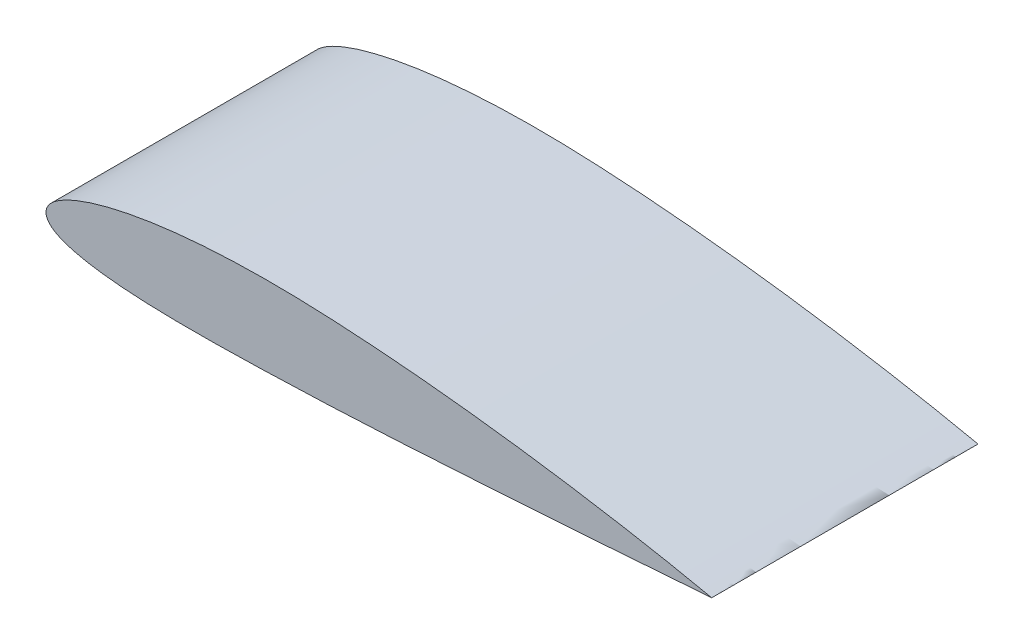
ISO-10303-21;
HEADER;
FILE_DESCRIPTION(('STEP AP214'),'2;1');
FILE_NAME('part.step','',(''),(''),'','','');
FILE_SCHEMA(('AUTOMOTIVE_DESIGN { 1 0 10303 214 1 1 1 1 }'));
ENDSEC;
DATA;
#1=APPLICATION_CONTEXT('core data for automotive mechanical design processes');
#2=APPLICATION_PROTOCOL_DEFINITION('international standard','automotive_design',2000,#1);
#3=PRODUCT_CONTEXT('',#1,'mechanical');
#4=PRODUCT('Part','Part','',(#3));
#5=PRODUCT_RELATED_PRODUCT_CATEGORY('part','',(#4));
#6=PRODUCT_DEFINITION_FORMATION('','',#4);
#7=PRODUCT_DEFINITION_CONTEXT('part definition',#1,'design');
#8=PRODUCT_DEFINITION('design','',#6,#7);
#9=PRODUCT_DEFINITION_SHAPE('','',#8);
#10=(LENGTH_UNIT() NAMED_UNIT(*) SI_UNIT(.MILLI.,.METRE.));
#11=(NAMED_UNIT(*) PLANE_ANGLE_UNIT() SI_UNIT($,.RADIAN.));
#12=(NAMED_UNIT(*) SI_UNIT($,.STERADIAN.) SOLID_ANGLE_UNIT());
#13=UNCERTAINTY_MEASURE_WITH_UNIT(LENGTH_MEASURE(1.E-05),#10,'distance_accuracy_value','');
#14=(GEOMETRIC_REPRESENTATION_CONTEXT(3) GLOBAL_UNCERTAINTY_ASSIGNED_CONTEXT((#13)) GLOBAL_UNIT_ASSIGNED_CONTEXT((#10,
#11,#12)) REPRESENTATION_CONTEXT('',''));
#15=CARTESIAN_POINT('',(0.,0.,0.));
#16=DIRECTION('',(0.,0.,1.));
#17=DIRECTION('',(1.,0.,0.));
#18=AXIS2_PLACEMENT_3D('',#15,#16,#17);
#19=CARTESIAN_POINT('',(750.,0.,300.));
#20=CARTESIAN_POINT('',(750.00059637436,0.00894434278039879,300.));
#21=CARTESIAN_POINT('',(749.60615658763,0.0711642119072489,300.));
#22=CARTESIAN_POINT('',(749.201769100923,0.178831621197275,300.));
#23=CARTESIAN_POINT('',(748.204040280567,0.379499827893671,300.));
#24=CARTESIAN_POINT('',(746.960563285463,0.649456270299362,300.));
#25=CARTESIAN_POINT('',(745.302702775964,0.999188412372496,300.));
#26=CARTESIAN_POINT('',(743.302006781728,1.42297216398564,300.));
#27=CARTESIAN_POINT('',(740.934106092303,1.92126984010554,300.));
#28=CARTESIAN_POINT('',(738.210413827483,2.4919705666027,300.));
#29=CARTESIAN_POINT('',(735.130338448377,3.1335764270224,300.));
#30=CARTESIAN_POINT('',(731.697748517541,3.84411503419558,300.));
#31=CARTESIAN_POINT('',(727.915504142312,4.62151932926806,300.));
#32=CARTESIAN_POINT('',(723.787220295921,5.46351214177191,300.));
#33=CARTESIAN_POINT('',(719.316708881753,6.36766549871789,300.));
#34=CARTESIAN_POINT('',(714.508147234259,7.33138851613699,300.));
#35=CARTESIAN_POINT('',(709.366025754072,8.35195649454599,300.));
#36=CARTESIAN_POINT('',(703.895159287034,9.42651323421049,300.));
#37=CARTESIAN_POINT('',(698.100680067457,10.5520851691694,300.));
#38=CARTESIAN_POINT('',(691.988036264319,11.7255980420855,300.));
#39=CARTESIAN_POINT('',(685.562987123017,12.9438842098815,300.));
#40=CARTESIAN_POINT('',(678.831600321564,14.2037000876167,300.));
#41=CARTESIAN_POINT('',(671.800246013912,15.50173123032,300.));
#42=CARTESIAN_POINT('',(664.475593694882,16.8346071590186,300.));
#43=CARTESIAN_POINT('',(656.864605861052,18.1989106035328,300.));
#44=CARTESIAN_POINT('',(648.974533560866,19.5911880609839,300.));
#45=CARTESIAN_POINT('',(640.812909382869,21.0079568672114,300.));
#46=CARTESIAN_POINT('',(632.387542800734,22.4457161871929,300.));
#47=CARTESIAN_POINT('',(623.706511867916,23.9009460271046,300.));
#48=CARTESIAN_POINT('',(614.778158513352,25.3701298762508,300.));
#49=CARTESIAN_POINT('',(605.611078588321,26.8497398325797,300.));
#50=CARTESIAN_POINT('',(596.214116219534,28.3362577685815,300.));
#51=CARTESIAN_POINT('',(586.596354865747,29.8261689247228,300.));
#52=CARTESIAN_POINT('',(576.767109792574,31.3159700996454,300.));
#53=CARTESIAN_POINT('',(566.735919718877,32.8021746656084,300.));
#54=CARTESIAN_POINT('',(556.512536872329,34.2813083699233,300.));
#55=CARTESIAN_POINT('',(546.106919094296,35.7499137091524,300.));
#56=CARTESIAN_POINT('',(535.529221012521,37.2045554047315,300.));
#57=CARTESIAN_POINT('',(524.789783258662,38.6418144160979,300.));
#58=CARTESIAN_POINT('',(513.899123696047,40.0582972449824,300.));
#59=CARTESIAN_POINT('',(502.867927239274,41.4506291819895,300.));
#60=CARTESIAN_POINT('',(491.707036444062,42.8154622701537,300.));
#61=CARTESIAN_POINT('',(480.427440563864,44.1494732994452,300.));
#62=CARTESIAN_POINT('',(469.040265480587,45.4493680497943,300.));
#63=CARTESIAN_POINT('',(457.556763764668,46.7118868613046,300.));
#64=CARTESIAN_POINT('',(445.988302839773,47.9337953639792,300.));
#65=CARTESIAN_POINT('',(434.346354991297,49.1119090562361,300.));
#66=CARTESIAN_POINT('',(422.642486098668,50.2430784717279,300.));
#67=CARTESIAN_POINT('',(410.888343887591,51.3242082441407,300.));
#68=CARTESIAN_POINT('',(399.09564827484,52.3522547914486,300.));
#69=CARTESIAN_POINT('',(387.276177438675,53.3242410567104,300.));
#70=CARTESIAN_POINT('',(375.441758266716,54.2372590824149,300.));
#71=CARTESIAN_POINT('',(363.604252654059,55.0884817082142,300.));
#72=CARTESIAN_POINT('',(351.775547127406,55.8751778848549,300.));
#73=CARTESIAN_POINT('',(339.967537937441,56.5946966390341,300.));
#74=CARTESIAN_POINT('',(328.192124234786,57.2445704730552,300.));
#75=CARTESIAN_POINT('',(316.461176066108,57.8221918121543,300.));
#76=CARTESIAN_POINT('',(304.768306728481,58.3268743213183,300.));
#77=CARTESIAN_POINT('',(293.112384318195,58.753638259663,300.));
#78=CARTESIAN_POINT('',(281.504387817428,59.0736602222852,300.));
#79=CARTESIAN_POINT('',(269.97492420862,59.2908265387338,300.));
#80=CARTESIAN_POINT('',(258.548725110707,59.4022458306176,300.));
#81=CARTESIAN_POINT('',(247.237859174899,59.4077214452801,300.));
#82=CARTESIAN_POINT('',(236.054271664185,59.3068210254286,300.));
#83=CARTESIAN_POINT('',(225.009797092654,59.0995570840153,300.));
#84=CARTESIAN_POINT('',(214.116133054755,58.7862203245225,300.));
#85=CARTESIAN_POINT('',(203.384824725658,58.3674287651453,300.));
#86=CARTESIAN_POINT('',(192.827247787594,57.8441138407992,300.));
#87=CARTESIAN_POINT('',(182.454589408909,57.2175280201313,300.));
#88=CARTESIAN_POINT('',(172.277833198406,56.4892441623344,300.));
#89=CARTESIAN_POINT('',(162.307739893302,55.6611428826921,300.));
#90=CARTESIAN_POINT('',(152.5548325072,54.7354225879151,300.));
#91=CARTESIAN_POINT('',(143.029379327512,53.7145716251483,300.));
#92=CARTESIAN_POINT('',(133.741378647357,52.6013761649744,300.));
#93=CARTESIAN_POINT('',(124.700543627353,51.3988951837205,300.));
#94=CARTESIAN_POINT('',(115.916288260485,50.1104556446286,300.));
#95=CARTESIAN_POINT('',(107.397714464839,48.7396219343625,300.));
#96=CARTESIAN_POINT('',(99.1535981088292,47.2901930790073,300.));
#97=CARTESIAN_POINT('',(91.192378725592,45.7661667014255,300.));
#98=CARTESIAN_POINT('',(83.5221475566035,44.1717266144834,300.));
#99=CARTESIAN_POINT('',(76.1506386793389,42.5112100465012,300.));
#100=CARTESIAN_POINT('',(69.0852184481354,40.789085372185,300.));
#101=CARTESIAN_POINT('',(62.3328781633523,39.0099218166641,300.));
#102=CARTESIAN_POINT('',(55.9002253368938,37.1783618866404,300.));
#103=CARTESIAN_POINT('',(49.7934790673985,35.2990842146928,300.));
#104=CARTESIAN_POINT('',(44.0184593584114,33.3767816273955,300.));
#105=CARTESIAN_POINT('',(38.5805848566515,31.4161171889753,300.));
#106=CARTESIAN_POINT('',(33.4848631135298,29.4216969587957,300.));
#107=CARTESIAN_POINT('',(28.735884498407,27.3980306495006,300.));
#108=CARTESIAN_POINT('',(24.3378104065495,25.3494989228903,300.));
#109=CARTESIAN_POINT('',(20.2943715104097,23.2802942230421,300.));
#110=CARTESIAN_POINT('',(16.60884868999,21.1943918560049,300.));
#111=CARTESIAN_POINT('',(13.2840709306175,19.0954721134246,300.));
#112=CARTESIAN_POINT('',(10.322413333847,16.9868432897934,300.));
#113=CARTESIAN_POINT('',(7.72581598515885,14.8713368856836,300.));
#114=CARTESIAN_POINT('',(5.49586661345299,12.7511594774266,300.));
#115=CARTESIAN_POINT('',(3.63399077626009,10.6277422260436,300.));
#116=CARTESIAN_POINT('',(2.14185089816681,8.50166071839382,300.));
#117=CARTESIAN_POINT('',(1.02196358650339,6.37287428461146,300.));
#118=CARTESIAN_POINT('',(0.278257301254894,4.24169294238076,300.));
#119=CARTESIAN_POINT('',(-0.0842820468450436,2.110324604644,300.));
#120=CARTESIAN_POINT('',(-0.0621879250578903,-0.00622322177395133,300.));
#121=CARTESIAN_POINT('',(0.335244441390352,-2.08508826508935,300.));
#122=CARTESIAN_POINT('',(1.11092356927229,-4.10240605481586,300.));
#123=CARTESIAN_POINT('',(2.25700131271319,-6.04489536656704,300.));
#124=CARTESIAN_POINT('',(3.76689792225681,-7.91232142303453,300.));
#125=CARTESIAN_POINT('',(5.63553840809136,-9.70626743748864,300.));
#126=CARTESIAN_POINT('',(7.85935473741906,-11.4285802963476,300.));
#127=CARTESIAN_POINT('',(10.4355523399722,-13.0805616083435,300.));
#128=CARTESIAN_POINT('',(13.361465929571,-14.6628841763932,300.));
#129=CARTESIAN_POINT('',(16.634217932586,-16.1757227990254,300.));
#130=CARTESIAN_POINT('',(20.2505624229221,-17.618947053466,300.));
#131=CARTESIAN_POINT('',(24.2068518392499,-18.9922499611621,300.));
#132=CARTESIAN_POINT('',(28.4990388201325,-20.295257981775,300.));
#133=CARTESIAN_POINT('',(33.1227044675192,-21.5275740052172,300.));
#134=CARTESIAN_POINT('',(38.0730763190668,-22.6888510802599,300.));
#135=CARTESIAN_POINT('',(43.3450588253787,-23.7787925695911,300.));
#136=CARTESIAN_POINT('',(48.9332501971088,-24.7972045180724,300.));
#137=CARTESIAN_POINT('',(54.8319638301147,-25.7439908680373,300.));
#138=CARTESIAN_POINT('',(61.0352432066026,-26.6191843629083,300.));
#139=CARTESIAN_POINT('',(67.5368739682601,-27.4229595331774,300.));
#140=CARTESIAN_POINT('',(74.3304007245167,-28.1556331189734,300.));
#141=CARTESIAN_POINT('',(81.4091346323397,-28.8176910960779,300.));
#142=CARTESIAN_POINT('',(88.766165502776,-29.4097890739869,300.));
#143=CARTESIAN_POINT('',(96.3943702706653,-29.9327570845801,300.));
#144=CARTESIAN_POINT('',(104.286420802727,-30.3876152036017,300.));
#145=CARTESIAN_POINT('',(112.434793530384,-30.7755688968869,300.));
#146=CARTESIAN_POINT('',(120.831774298599,-31.0980184951465,300.));
#147=CARTESIAN_POINT('',(129.4694659191,-31.3565532309368,300.));
#148=CARTESIAN_POINT('',(138.339791884653,-31.5529598859742,300.));
#149=CARTESIAN_POINT('',(147.434503477732,-31.6892036154795,300.));
#150=CARTESIAN_POINT('',(156.745182872919,-31.7674421621881,300.));
#151=CARTESIAN_POINT('',(166.263248374246,-31.7900047620677,300.));
#152=CARTESIAN_POINT('',(175.979958031053,-31.7593833864774,300.));
#153=CARTESIAN_POINT('',(185.88641218177,-31.6782349576502,300.));
#154=CARTESIAN_POINT('',(195.973558135713,-31.5493502747081,300.));
#155=CARTESIAN_POINT('',(206.232191309082,-31.3756554883181,300.));
#156=CARTESIAN_POINT('',(216.652961287394,-31.1601897358165,300.));
#157=CARTESIAN_POINT('',(227.22637168009,-30.9060836809872,300.));
#158=CARTESIAN_POINT('',(237.942786845426,-30.616554940642,300.));
#159=CARTESIAN_POINT('',(248.792431229334,-30.2948680420496,300.));
#160=CARTESIAN_POINT('',(259.765398207883,-29.9443634145448,300.));
#161=CARTESIAN_POINT('',(270.851644578268,-29.568262881412,300.));
#162=CARTESIAN_POINT('',(282.041023411475,-29.1703280661753,300.));
#163=CARTESIAN_POINT('',(293.335847272423,-28.7517803698554,300.));
#164=CARTESIAN_POINT('',(304.744079475362,-28.3212871537351,300.));
#165=CARTESIAN_POINT('',(316.253882213853,-27.8553145110932,300.));
#166=CARTESIAN_POINT('',(327.84133776041,-27.3540098898144,300.));
#167=CARTESIAN_POINT('',(339.477036028816,-26.8216193645963,300.));
#168=CARTESIAN_POINT('',(351.149748845449,-26.2606394425348,300.));
#169=CARTESIAN_POINT('',(362.848204809782,-25.6737923030507,300.));
#170=CARTESIAN_POINT('',(374.561084599981,-25.0636864707445,300.));
#171=CARTESIAN_POINT('',(386.27703466142,-24.4328830779712,300.));
#172=CARTESIAN_POINT('',(397.984677963689,-23.7838695206583,300.));
#173=CARTESIAN_POINT('',(409.6726246001,-23.119050854833,300.));
#174=CARTESIAN_POINT('',(421.32948267388,-22.4407451180017,300.));
#175=CARTESIAN_POINT('',(432.943869076346,-21.7511733955792,300.));
#176=CARTESIAN_POINT('',(444.504420608589,-21.0524569493498,300.));
#177=CARTESIAN_POINT('',(455.999806450058,-20.3466152351302,300.));
#178=CARTESIAN_POINT('',(467.418738031147,-19.6355570237376,300.));
#179=CARTESIAN_POINT('',(478.749982711487,-18.9210899967334,300.));
#180=CARTESIAN_POINT('',(489.982372579822,-18.2049132901543,300.));
#181=CARTESIAN_POINT('',(501.104817596844,-17.4886215029185,300.));
#182=CARTESIAN_POINT('',(512.106315815742,-16.7737116531863,300.));
#183=CARTESIAN_POINT('',(522.975966513668,-16.0615839200863,300.));
#184=CARTESIAN_POINT('',(533.702979951577,-15.3535473417991,300.));
#185=CARTESIAN_POINT('',(544.276689408692,-14.6508222762654,300.));
#186=CARTESIAN_POINT('',(554.686561699279,-13.9545587823822,300.));
#187=CARTESIAN_POINT('',(564.922208119706,-13.2658280271782,300.));
#188=CARTESIAN_POINT('',(574.973395277044,-12.5856371480608,300.));
#189=CARTESIAN_POINT('',(584.830057348914,-11.9149448480258,300.));
#190=CARTESIAN_POINT('',(594.482304398462,-11.2546497917867,300.));
#191=CARTESIAN_POINT('',(603.920434360283,-10.6056160357272,300.));
#192=CARTESIAN_POINT('',(613.134942692762,-9.96867127819963,300.));
#193=CARTESIAN_POINT('',(622.116532428783,-9.34461366084966,300.));
#194=CARTESIAN_POINT('',(630.856124840554,-8.7342221768373,300.));
#195=CARTESIAN_POINT('',(639.344868529452,-8.13825506433839,300.));
#196=CARTESIAN_POINT('',(647.574150201306,-7.5574648820344,300.));
#197=CARTESIAN_POINT('',(655.535603007805,-6.99259340468956,300.));
#198=CARTESIAN_POINT('',(663.221116035034,-6.44437690007199,300.));
#199=CARTESIAN_POINT('',(670.622845006048,-5.91355360613789,300.));
#200=CARTESIAN_POINT('',(677.733219491543,-5.40085896057276,300.));
#201=CARTESIAN_POINT('',(684.544953263229,-4.9070266411324,300.));
#202=CARTESIAN_POINT('',(691.051051658428,-4.43279708316975,300.));
#203=CARTESIAN_POINT('',(697.244821279478,-3.9788997276204,300.));
#204=CARTESIAN_POINT('',(703.11987707755,-3.54606900060208,300.));
#205=CARTESIAN_POINT('',(708.67015176343,-3.13503090879763,300.));
#206=CARTESIAN_POINT('',(713.889901711541,-2.74649743024143,300.));
#207=CARTESIAN_POINT('',(718.77371572058,-2.38117374563713,300.));
#208=CARTESIAN_POINT('',(723.316524999556,-2.03974423436645,300.));
#209=CARTESIAN_POINT('',(727.513594944654,-1.72287095578056,300.));
#210=CARTESIAN_POINT('',(731.360583881869,-1.43118770743668,300.));
#211=CARTESIAN_POINT('',(734.853376595702,-1.16529510289584,300.));
#212=CARTESIAN_POINT('',(737.988646567276,-0.925772917266211,300.));
#213=CARTESIAN_POINT('',(740.762098965446,-0.713079116157727,300.));
#214=CARTESIAN_POINT('',(743.173936021538,-0.52788778962953,300.));
#215=CARTESIAN_POINT('',(745.212408392852,-0.370011539588302,300.));
#216=CARTESIAN_POINT('',(746.901581634662,-0.241554590658317,300.));
#217=CARTESIAN_POINT('',(748.169678739611,-0.138157222713589,300.));
#218=CARTESIAN_POINT('',(749.185121578828,-0.0713711351296544,300.));
#219=CARTESIAN_POINT('',(749.600202192631,-0.0182609895391847,300.));
#220=CARTESIAN_POINT('',(749.99940362818,-0.00894430468257293,300.));
#221=CARTESIAN_POINT('',(750.,0.,300.));
#222=B_SPLINE_CURVE_WITH_KNOTS('',3,(#19,#20,#21,#22,#23,#24,#25,#26,#27,#28,#29,#30,#31,#32,
#33,#34,#35,#36,#37,#38,#39,#40,#41,#42,#43,#44,#45,#46,#47,#48,#49,#50,#51,#52,#53,#54,#55,#56,
#57,#58,#59,#60,#61,#62,#63,#64,#65,#66,#67,#68,#69,#70,#71,#72,#73,#74,#75,#76,#77,#78,#79,#80,
#81,#82,#83,#84,#85,#86,#87,#88,#89,#90,#91,#92,#93,#94,#95,#96,#97,#98,#99,#100,#101,#102,#103,
#104,#105,#106,#107,#108,#109,#110,#111,#112,#113,#114,#115,#116,#117,#118,#119,#120,#121,#122,
#123,#124,#125,#126,#127,#128,#129,#130,#131,#132,#133,#134,#135,#136,#137,#138,#139,#140,#141,
#142,#143,#144,#145,#146,#147,#148,#149,#150,#151,#152,#153,#154,#155,#156,#157,#158,#159,#160,
#161,#162,#163,#164,#165,#166,#167,#168,#169,#170,#171,#172,#173,#174,#175,#176,#177,#178,#179,
#180,#181,#182,#183,#184,#185,#186,#187,#188,#189,#190,#191,#192,#193,#194,#195,#196,#197,#198,
#199,#200,#201,#202,#203,#204,#205,#206,#207,#208,#209,#210,#211,#212,#213,#214,#215,#216,#217,
#218,#219,#220,#221),.UNSPECIFIED.,.T.,.F.,(4,1,1,1,1,1,1,1,1,1,1,1,1,1,1,1,1,1,1,1,1,1,1,1,1,1,
1,1,1,1,1,1,1,1,1,1,1,1,1,1,1,1,1,1,1,1,1,1,1,1,1,1,1,1,1,1,1,1,1,1,1,1,1,1,1,1,1,1,1,1,1,1,1,1,
1,1,1,1,1,1,1,1,1,1,1,1,1,1,1,1,1,1,1,1,1,1,1,1,1,1,1,1,1,1,1,1,1,1,1,1,1,1,1,1,1,1,1,1,1,1,1,1,
1,1,1,1,1,1,1,1,1,1,1,1,1,1,1,1,1,1,1,1,1,1,1,1,1,1,1,1,1,1,1,1,1,1,1,1,1,1,1,1,1,1,1,1,1,1,1,1,
1,1,1,1,1,1,1,1,1,1,1,1,1,1,1,1,1,1,1,1,1,1,1,1,1,1,1,1,1,1,4),(0.,0.000122379526219418,
0.000489393934242715,0.0011006708442205,0.00195559087417023,0.00305328806125948,
0.00439265097944524,0.00597232306531816,0.00779070859232981,0.00984596852789568,
0.0121360288733665,0.0146585787955268,0.0174110774589511,0.0203907538425948,0.023594611521331,
0.0270194340848003,0.0306617853910921,0.0345180155557075,0.0385842658600357,0.0428564710579365,
0.0473303646869126,0.0520014843549915,0.0568651754125301,0.0619165943227794,0.0671507178757192,
0.0725623435336317,0.0781460963900936,0.0838964350048582,0.0898076547455636,0.0958738953847061,
0.102089144821709,0.108447245706325,0.114941900546506,0.121566677351257,0.128315016742029,
0.135180237547704,0.142155541117404,0.149234020475161,0.156408666729702,0.16367237370535,
0.171017945722381,0.178438106461147,0.185925504142202,0.193472719332877,0.201072273817932,
0.208716636529681,0.216398235012732,0.224109458574965,0.231842672226539,0.239590219808424,
0.247344438696116,0.255097662929863,0.262842236056038,0.270570519317459,0.278274899909376,
0.285947801838502,0.293581693128175,0.301204962501008,0.308799342158639,0.316332599380389,
0.323797398431745,0.331186489883989,0.338492716376622,0.345709023991109,0.35282846888675,
0.359844228373424,0.366749609363242,0.373538053434806,0.380203152445548,0.386738648770577,
0.393138451090368,0.399396638171703,0.405507470229925,0.411465396362775,0.41726506574649,
0.422901334622364,0.42836928088811,0.433664212930504,0.438781683538432,0.443717505739822,
0.448467769228042,0.453028862200621,0.457397494616231,0.461570729312972,0.465546018382526,
0.469321251396038,0.472894812000899,0.476265656869378,0.479433415667584,0.482398521790502,
0.485162390566742,0.487727657352882,0.490098505330126,0.49228111045637,0.494284243734673,
0.496120072573903,0.497805161219031,0.499361588009031,0.500817880111078,0.502209190542024,
0.50357598024236,0.504942762863381,0.506333878068483,0.507789314587988,0.509343562964949,
0.511024414753632,0.512853216003413,0.514845834431592,0.517013791898336,0.519365263772125,
0.521905878330572,0.524639316715791,0.527567756370775,0.530692198952171,0.534012705632508,
0.537528579002625,0.541238491827433,0.545140592985183,0.549232579305468,0.553511760133102,
0.557975100210742,0.562619262778327,0.567440635423553,0.572435354739772,0.577599329158005,
0.582928253014114,0.588417623052892,0.594062747088006,0.59985875661756,0.605800613007089,
0.611883118328297,0.61810091955194,0.624448515702408,0.630920265338279,0.637510387320099,
0.644212971856322,0.651021980388785,0.657931255893389,0.664934521928596,0.672025394823855,
0.679197381391584,0.686443891525275,0.693758239076311,0.701133649141969,0.708588086832467,
0.716125335513148,0.723702286696347,0.731311634445121,0.738946019491122,0.746598038371046,
0.754260250882362,0.761925187750964,0.769585360531168,0.777233270863281,0.784861416199554,
0.792462299420943,0.800028438211827,0.807552370392148,0.815026665764844,0.822443931004298,
0.82979681996633,0.837078037823698,0.844280352876973,0.851396600575067,0.85841969396759,
0.865342628168785,0.872158489132555,0.878860458966725,0.885441824658568,0.891895983518514,
0.898216451093588,0.904396865754413,0.910430996363446,0.916312749194657,0.922036172148087,
0.927595463092015,0.932984975318937,0.938199222754594,0.943232886283173,0.948080820019768,
0.952738058555498,0.957199818152499,0.961461508357249,0.965518732314991,0.969367296286498,
0.973003211269068,0.97642270234438,0.979622209223991,0.982598395145935,0.98534814967421,
0.987868592203214,0.990157078574435,0.992211202331564,0.994028801147666,0.995607958691053,
0.996947006446502,0.998044530294918,0.998899367676009,0.999510613967512,0.999877620995048,1.),.UNSPECIFIED.);
#223=DIRECTION('',(0.,0.,-1.));
#224=VECTOR('',#223,1.);
#225=SURFACE_OF_LINEAR_EXTRUSION('',#222,#224);
#226=CARTESIAN_POINT('',(750.,0.,300.));
#227=VERTEX_POINT('',#226);
#228=EDGE_CURVE('E10',#227,#227,#222,.T.);
#229=ORIENTED_EDGE('',*,*,#228,.F.);
#230=EDGE_LOOP('',(#229));
#231=FACE_BOUND('',#230,.T.);
#232=CARTESIAN_POINT('',(750.,0.,0.));
#233=CARTESIAN_POINT('',(750.00059637436,0.00894434278039879,0.));
#234=CARTESIAN_POINT('',(749.60615658763,0.0711642119072489,0.));
#235=CARTESIAN_POINT('',(749.201769100923,0.178831621197275,0.));
#236=CARTESIAN_POINT('',(748.204040280567,0.379499827893671,0.));
#237=CARTESIAN_POINT('',(746.960563285463,0.649456270299362,0.));
#238=CARTESIAN_POINT('',(745.302702775964,0.999188412372496,0.));
#239=CARTESIAN_POINT('',(743.302006781728,1.42297216398564,0.));
#240=CARTESIAN_POINT('',(740.934106092303,1.92126984010554,0.));
#241=CARTESIAN_POINT('',(738.210413827483,2.4919705666027,0.));
#242=CARTESIAN_POINT('',(735.130338448377,3.1335764270224,0.));
#243=CARTESIAN_POINT('',(731.697748517541,3.84411503419558,0.));
#244=CARTESIAN_POINT('',(727.915504142312,4.62151932926806,0.));
#245=CARTESIAN_POINT('',(723.787220295921,5.46351214177191,0.));
#246=CARTESIAN_POINT('',(719.316708881753,6.36766549871789,0.));
#247=CARTESIAN_POINT('',(714.508147234259,7.33138851613699,0.));
#248=CARTESIAN_POINT('',(709.366025754072,8.35195649454599,0.));
#249=CARTESIAN_POINT('',(703.895159287034,9.42651323421049,0.));
#250=CARTESIAN_POINT('',(698.100680067457,10.5520851691694,0.));
#251=CARTESIAN_POINT('',(691.988036264319,11.7255980420855,0.));
#252=CARTESIAN_POINT('',(685.562987123017,12.9438842098815,0.));
#253=CARTESIAN_POINT('',(678.831600321564,14.2037000876167,0.));
#254=CARTESIAN_POINT('',(671.800246013912,15.50173123032,0.));
#255=CARTESIAN_POINT('',(664.475593694882,16.8346071590186,0.));
#256=CARTESIAN_POINT('',(656.864605861052,18.1989106035328,0.));
#257=CARTESIAN_POINT('',(648.974533560866,19.5911880609839,0.));
#258=CARTESIAN_POINT('',(640.812909382869,21.0079568672114,0.));
#259=CARTESIAN_POINT('',(632.387542800734,22.4457161871929,0.));
#260=CARTESIAN_POINT('',(623.706511867916,23.9009460271046,0.));
#261=CARTESIAN_POINT('',(614.778158513352,25.3701298762508,0.));
#262=CARTESIAN_POINT('',(605.611078588321,26.8497398325797,0.));
#263=CARTESIAN_POINT('',(596.214116219534,28.3362577685815,0.));
#264=CARTESIAN_POINT('',(586.596354865747,29.8261689247228,0.));
#265=CARTESIAN_POINT('',(576.767109792574,31.3159700996454,0.));
#266=CARTESIAN_POINT('',(566.735919718877,32.8021746656084,0.));
#267=CARTESIAN_POINT('',(556.512536872329,34.2813083699233,0.));
#268=CARTESIAN_POINT('',(546.106919094296,35.7499137091524,0.));
#269=CARTESIAN_POINT('',(535.529221012521,37.2045554047315,0.));
#270=CARTESIAN_POINT('',(524.789783258662,38.6418144160979,0.));
#271=CARTESIAN_POINT('',(513.899123696047,40.0582972449824,0.));
#272=CARTESIAN_POINT('',(502.867927239274,41.4506291819895,0.));
#273=CARTESIAN_POINT('',(491.707036444062,42.8154622701537,0.));
#274=CARTESIAN_POINT('',(480.427440563864,44.1494732994452,0.));
#275=CARTESIAN_POINT('',(469.040265480587,45.4493680497943,0.));
#276=CARTESIAN_POINT('',(457.556763764668,46.7118868613046,0.));
#277=CARTESIAN_POINT('',(445.988302839773,47.9337953639792,0.));
#278=CARTESIAN_POINT('',(434.346354991297,49.1119090562361,0.));
#279=CARTESIAN_POINT('',(422.642486098668,50.2430784717279,0.));
#280=CARTESIAN_POINT('',(410.888343887591,51.3242082441407,0.));
#281=CARTESIAN_POINT('',(399.09564827484,52.3522547914486,0.));
#282=CARTESIAN_POINT('',(387.276177438675,53.3242410567104,0.));
#283=CARTESIAN_POINT('',(375.441758266716,54.2372590824149,0.));
#284=CARTESIAN_POINT('',(363.604252654059,55.0884817082142,0.));
#285=CARTESIAN_POINT('',(351.775547127406,55.8751778848549,0.));
#286=CARTESIAN_POINT('',(339.967537937441,56.5946966390341,0.));
#287=CARTESIAN_POINT('',(328.192124234786,57.2445704730552,0.));
#288=CARTESIAN_POINT('',(316.461176066108,57.8221918121543,0.));
#289=CARTESIAN_POINT('',(304.768306728481,58.3268743213183,0.));
#290=CARTESIAN_POINT('',(293.112384318195,58.753638259663,0.));
#291=CARTESIAN_POINT('',(281.504387817428,59.0736602222852,0.));
#292=CARTESIAN_POINT('',(269.97492420862,59.2908265387338,0.));
#293=CARTESIAN_POINT('',(258.548725110707,59.4022458306176,0.));
#294=CARTESIAN_POINT('',(247.237859174899,59.4077214452801,0.));
#295=CARTESIAN_POINT('',(236.054271664185,59.3068210254286,0.));
#296=CARTESIAN_POINT('',(225.009797092654,59.0995570840153,0.));
#297=CARTESIAN_POINT('',(214.116133054755,58.7862203245225,0.));
#298=CARTESIAN_POINT('',(203.384824725658,58.3674287651453,0.));
#299=CARTESIAN_POINT('',(192.827247787594,57.8441138407992,0.));
#300=CARTESIAN_POINT('',(182.454589408909,57.2175280201313,0.));
#301=CARTESIAN_POINT('',(172.277833198406,56.4892441623344,0.));
#302=CARTESIAN_POINT('',(162.307739893302,55.6611428826921,0.));
#303=CARTESIAN_POINT('',(152.5548325072,54.7354225879151,0.));
#304=CARTESIAN_POINT('',(143.029379327512,53.7145716251483,0.));
#305=CARTESIAN_POINT('',(133.741378647357,52.6013761649744,0.));
#306=CARTESIAN_POINT('',(124.700543627353,51.3988951837205,0.));
#307=CARTESIAN_POINT('',(115.916288260485,50.1104556446286,0.));
#308=CARTESIAN_POINT('',(107.397714464839,48.7396219343625,0.));
#309=CARTESIAN_POINT('',(99.1535981088292,47.2901930790073,0.));
#310=CARTESIAN_POINT('',(91.192378725592,45.7661667014255,0.));
#311=CARTESIAN_POINT('',(83.5221475566035,44.1717266144834,0.));
#312=CARTESIAN_POINT('',(76.1506386793389,42.5112100465012,0.));
#313=CARTESIAN_POINT('',(69.0852184481354,40.789085372185,0.));
#314=CARTESIAN_POINT('',(62.3328781633523,39.0099218166641,0.));
#315=CARTESIAN_POINT('',(55.9002253368938,37.1783618866404,0.));
#316=CARTESIAN_POINT('',(49.7934790673985,35.2990842146928,0.));
#317=CARTESIAN_POINT('',(44.0184593584114,33.3767816273955,0.));
#318=CARTESIAN_POINT('',(38.5805848566515,31.4161171889753,0.));
#319=CARTESIAN_POINT('',(33.4848631135298,29.4216969587957,0.));
#320=CARTESIAN_POINT('',(28.735884498407,27.3980306495006,0.));
#321=CARTESIAN_POINT('',(24.3378104065495,25.3494989228903,0.));
#322=CARTESIAN_POINT('',(20.2943715104097,23.2802942230421,0.));
#323=CARTESIAN_POINT('',(16.60884868999,21.1943918560049,0.));
#324=CARTESIAN_POINT('',(13.2840709306175,19.0954721134246,0.));
#325=CARTESIAN_POINT('',(10.322413333847,16.9868432897934,0.));
#326=CARTESIAN_POINT('',(7.72581598515885,14.8713368856836,0.));
#327=CARTESIAN_POINT('',(5.49586661345299,12.7511594774266,0.));
#328=CARTESIAN_POINT('',(3.63399077626009,10.6277422260436,0.));
#329=CARTESIAN_POINT('',(2.14185089816681,8.50166071839382,0.));
#330=CARTESIAN_POINT('',(1.02196358650339,6.37287428461146,0.));
#331=CARTESIAN_POINT('',(0.278257301254894,4.24169294238076,0.));
#332=CARTESIAN_POINT('',(-0.0842820468450436,2.110324604644,0.));
#333=CARTESIAN_POINT('',(-0.0621879250578903,-0.00622322177395133,0.));
#334=CARTESIAN_POINT('',(0.335244441390352,-2.08508826508935,0.));
#335=CARTESIAN_POINT('',(1.11092356927229,-4.10240605481586,0.));
#336=CARTESIAN_POINT('',(2.25700131271319,-6.04489536656704,0.));
#337=CARTESIAN_POINT('',(3.76689792225681,-7.91232142303453,0.));
#338=CARTESIAN_POINT('',(5.63553840809136,-9.70626743748864,0.));
#339=CARTESIAN_POINT('',(7.85935473741906,-11.4285802963476,0.));
#340=CARTESIAN_POINT('',(10.4355523399722,-13.0805616083435,0.));
#341=CARTESIAN_POINT('',(13.361465929571,-14.6628841763932,0.));
#342=CARTESIAN_POINT('',(16.634217932586,-16.1757227990254,0.));
#343=CARTESIAN_POINT('',(20.2505624229221,-17.618947053466,0.));
#344=CARTESIAN_POINT('',(24.2068518392499,-18.9922499611621,0.));
#345=CARTESIAN_POINT('',(28.4990388201325,-20.295257981775,0.));
#346=CARTESIAN_POINT('',(33.1227044675192,-21.5275740052172,0.));
#347=CARTESIAN_POINT('',(38.0730763190668,-22.6888510802599,0.));
#348=CARTESIAN_POINT('',(43.3450588253787,-23.7787925695911,0.));
#349=CARTESIAN_POINT('',(48.9332501971088,-24.7972045180724,0.));
#350=CARTESIAN_POINT('',(54.8319638301147,-25.7439908680373,0.));
#351=CARTESIAN_POINT('',(61.0352432066026,-26.6191843629083,0.));
#352=CARTESIAN_POINT('',(67.5368739682601,-27.4229595331774,0.));
#353=CARTESIAN_POINT('',(74.3304007245167,-28.1556331189734,0.));
#354=CARTESIAN_POINT('',(81.4091346323397,-28.8176910960779,0.));
#355=CARTESIAN_POINT('',(88.766165502776,-29.4097890739869,0.));
#356=CARTESIAN_POINT('',(96.3943702706653,-29.9327570845801,0.));
#357=CARTESIAN_POINT('',(104.286420802727,-30.3876152036017,0.));
#358=CARTESIAN_POINT('',(112.434793530384,-30.7755688968869,0.));
#359=CARTESIAN_POINT('',(120.831774298599,-31.0980184951465,0.));
#360=CARTESIAN_POINT('',(129.4694659191,-31.3565532309368,0.));
#361=CARTESIAN_POINT('',(138.339791884653,-31.5529598859742,0.));
#362=CARTESIAN_POINT('',(147.434503477732,-31.6892036154795,0.));
#363=CARTESIAN_POINT('',(156.745182872919,-31.7674421621881,0.));
#364=CARTESIAN_POINT('',(166.263248374246,-31.7900047620677,0.));
#365=CARTESIAN_POINT('',(175.979958031053,-31.7593833864774,0.));
#366=CARTESIAN_POINT('',(185.88641218177,-31.6782349576502,0.));
#367=CARTESIAN_POINT('',(195.973558135713,-31.5493502747081,0.));
#368=CARTESIAN_POINT('',(206.232191309082,-31.3756554883181,0.));
#369=CARTESIAN_POINT('',(216.652961287394,-31.1601897358165,0.));
#370=CARTESIAN_POINT('',(227.22637168009,-30.9060836809872,0.));
#371=CARTESIAN_POINT('',(237.942786845426,-30.616554940642,0.));
#372=CARTESIAN_POINT('',(248.792431229334,-30.2948680420496,0.));
#373=CARTESIAN_POINT('',(259.765398207883,-29.9443634145448,0.));
#374=CARTESIAN_POINT('',(270.851644578268,-29.568262881412,0.));
#375=CARTESIAN_POINT('',(282.041023411475,-29.1703280661753,0.));
#376=CARTESIAN_POINT('',(293.335847272423,-28.7517803698554,0.));
#377=CARTESIAN_POINT('',(304.744079475362,-28.3212871537351,0.));
#378=CARTESIAN_POINT('',(316.253882213853,-27.8553145110932,0.));
#379=CARTESIAN_POINT('',(327.84133776041,-27.3540098898144,0.));
#380=CARTESIAN_POINT('',(339.477036028816,-26.8216193645963,0.));
#381=CARTESIAN_POINT('',(351.149748845449,-26.2606394425348,0.));
#382=CARTESIAN_POINT('',(362.848204809782,-25.6737923030507,0.));
#383=CARTESIAN_POINT('',(374.561084599981,-25.0636864707445,0.));
#384=CARTESIAN_POINT('',(386.27703466142,-24.4328830779712,0.));
#385=CARTESIAN_POINT('',(397.984677963689,-23.7838695206583,0.));
#386=CARTESIAN_POINT('',(409.6726246001,-23.119050854833,0.));
#387=CARTESIAN_POINT('',(421.32948267388,-22.4407451180017,0.));
#388=CARTESIAN_POINT('',(432.943869076346,-21.7511733955792,0.));
#389=CARTESIAN_POINT('',(444.504420608589,-21.0524569493498,0.));
#390=CARTESIAN_POINT('',(455.999806450058,-20.3466152351302,0.));
#391=CARTESIAN_POINT('',(467.418738031147,-19.6355570237376,0.));
#392=CARTESIAN_POINT('',(478.749982711487,-18.9210899967334,0.));
#393=CARTESIAN_POINT('',(489.982372579822,-18.2049132901543,0.));
#394=CARTESIAN_POINT('',(501.104817596844,-17.4886215029185,0.));
#395=CARTESIAN_POINT('',(512.106315815742,-16.7737116531863,0.));
#396=CARTESIAN_POINT('',(522.975966513668,-16.0615839200863,0.));
#397=CARTESIAN_POINT('',(533.702979951577,-15.3535473417991,0.));
#398=CARTESIAN_POINT('',(544.276689408692,-14.6508222762654,0.));
#399=CARTESIAN_POINT('',(554.686561699279,-13.9545587823822,0.));
#400=CARTESIAN_POINT('',(564.922208119706,-13.2658280271782,0.));
#401=CARTESIAN_POINT('',(574.973395277044,-12.5856371480608,0.));
#402=CARTESIAN_POINT('',(584.830057348914,-11.9149448480258,0.));
#403=CARTESIAN_POINT('',(594.482304398462,-11.2546497917867,0.));
#404=CARTESIAN_POINT('',(603.920434360283,-10.6056160357272,0.));
#405=CARTESIAN_POINT('',(613.134942692762,-9.96867127819963,0.));
#406=CARTESIAN_POINT('',(622.116532428783,-9.34461366084966,0.));
#407=CARTESIAN_POINT('',(630.856124840554,-8.7342221768373,0.));
#408=CARTESIAN_POINT('',(639.344868529452,-8.13825506433839,0.));
#409=CARTESIAN_POINT('',(647.574150201306,-7.5574648820344,0.));
#410=CARTESIAN_POINT('',(655.535603007805,-6.99259340468956,0.));
#411=CARTESIAN_POINT('',(663.221116035034,-6.44437690007199,0.));
#412=CARTESIAN_POINT('',(670.622845006048,-5.91355360613789,0.));
#413=CARTESIAN_POINT('',(677.733219491543,-5.40085896057276,0.));
#414=CARTESIAN_POINT('',(684.544953263229,-4.9070266411324,0.));
#415=CARTESIAN_POINT('',(691.051051658428,-4.43279708316975,0.));
#416=CARTESIAN_POINT('',(697.244821279478,-3.9788997276204,0.));
#417=CARTESIAN_POINT('',(703.11987707755,-3.54606900060208,0.));
#418=CARTESIAN_POINT('',(708.67015176343,-3.13503090879763,0.));
#419=CARTESIAN_POINT('',(713.889901711541,-2.74649743024143,0.));
#420=CARTESIAN_POINT('',(718.77371572058,-2.38117374563713,0.));
#421=CARTESIAN_POINT('',(723.316524999556,-2.03974423436645,0.));
#422=CARTESIAN_POINT('',(727.513594944654,-1.72287095578056,0.));
#423=CARTESIAN_POINT('',(731.360583881869,-1.43118770743668,0.));
#424=CARTESIAN_POINT('',(734.853376595702,-1.16529510289584,0.));
#425=CARTESIAN_POINT('',(737.988646567276,-0.925772917266211,0.));
#426=CARTESIAN_POINT('',(740.762098965446,-0.713079116157727,0.));
#427=CARTESIAN_POINT('',(743.173936021538,-0.52788778962953,0.));
#428=CARTESIAN_POINT('',(745.212408392852,-0.370011539588302,0.));
#429=CARTESIAN_POINT('',(746.901581634662,-0.241554590658317,0.));
#430=CARTESIAN_POINT('',(748.169678739611,-0.138157222713589,0.));
#431=CARTESIAN_POINT('',(749.185121578828,-0.0713711351296544,0.));
#432=CARTESIAN_POINT('',(749.600202192631,-0.0182609895391847,0.));
#433=CARTESIAN_POINT('',(749.99940362818,-0.00894430468257293,0.));
#434=CARTESIAN_POINT('',(750.,0.,0.));
#435=B_SPLINE_CURVE_WITH_KNOTS('',3,(#232,#233,#234,#235,#236,#237,#238,#239,#240,#241,#242,
#243,#244,#245,#246,#247,#248,#249,#250,#251,#252,#253,#254,#255,#256,#257,#258,#259,#260,#261,
#262,#263,#264,#265,#266,#267,#268,#269,#270,#271,#272,#273,#274,#275,#276,#277,#278,#279,#280,
#281,#282,#283,#284,#285,#286,#287,#288,#289,#290,#291,#292,#293,#294,#295,#296,#297,#298,#299,
#300,#301,#302,#303,#304,#305,#306,#307,#308,#309,#310,#311,#312,#313,#314,#315,#316,#317,#318,
#319,#320,#321,#322,#323,#324,#325,#326,#327,#328,#329,#330,#331,#332,#333,#334,#335,#336,#337,
#338,#339,#340,#341,#342,#343,#344,#345,#346,#347,#348,#349,#350,#351,#352,#353,#354,#355,#356,
#357,#358,#359,#360,#361,#362,#363,#364,#365,#366,#367,#368,#369,#370,#371,#372,#373,#374,#375,
#376,#377,#378,#379,#380,#381,#382,#383,#384,#385,#386,#387,#388,#389,#390,#391,#392,#393,#394,
#395,#396,#397,#398,#399,#400,#401,#402,#403,#404,#405,#406,#407,#408,#409,#410,#411,#412,#413,
#414,#415,#416,#417,#418,#419,#420,#421,#422,#423,#424,#425,#426,#427,#428,#429,#430,#431,#432,
#433,#434),.UNSPECIFIED.,.T.,.F.,(4,1,1,1,1,1,1,1,1,1,1,1,1,1,1,1,1,1,1,1,1,1,1,1,1,1,1,1,1,1,1,
1,1,1,1,1,1,1,1,1,1,1,1,1,1,1,1,1,1,1,1,1,1,1,1,1,1,1,1,1,1,1,1,1,1,1,1,1,1,1,1,1,1,1,1,1,1,1,1,
1,1,1,1,1,1,1,1,1,1,1,1,1,1,1,1,1,1,1,1,1,1,1,1,1,1,1,1,1,1,1,1,1,1,1,1,1,1,1,1,1,1,1,1,1,1,1,1,
1,1,1,1,1,1,1,1,1,1,1,1,1,1,1,1,1,1,1,1,1,1,1,1,1,1,1,1,1,1,1,1,1,1,1,1,1,1,1,1,1,1,1,1,1,1,1,1,
1,1,1,1,1,1,1,1,1,1,1,1,1,1,1,1,1,1,1,1,1,1,1,1,1,4),(0.,0.000122379526219418,
0.000489393934242715,0.0011006708442205,0.00195559087417023,0.00305328806125948,
0.00439265097944524,0.00597232306531816,0.00779070859232981,0.00984596852789568,
0.0121360288733665,0.0146585787955268,0.0174110774589511,0.0203907538425948,0.023594611521331,
0.0270194340848003,0.0306617853910921,0.0345180155557075,0.0385842658600357,0.0428564710579365,
0.0473303646869126,0.0520014843549915,0.0568651754125301,0.0619165943227794,0.0671507178757192,
0.0725623435336317,0.0781460963900936,0.0838964350048582,0.0898076547455636,0.0958738953847061,
0.102089144821709,0.108447245706325,0.114941900546506,0.121566677351257,0.128315016742029,
0.135180237547704,0.142155541117404,0.149234020475161,0.156408666729702,0.16367237370535,
0.171017945722381,0.178438106461147,0.185925504142202,0.193472719332877,0.201072273817932,
0.208716636529681,0.216398235012732,0.224109458574965,0.231842672226539,0.239590219808424,
0.247344438696116,0.255097662929863,0.262842236056038,0.270570519317459,0.278274899909376,
0.285947801838502,0.293581693128175,0.301204962501008,0.308799342158639,0.316332599380389,
0.323797398431745,0.331186489883989,0.338492716376622,0.345709023991109,0.35282846888675,
0.359844228373424,0.366749609363242,0.373538053434806,0.380203152445548,0.386738648770577,
0.393138451090368,0.399396638171703,0.405507470229925,0.411465396362775,0.41726506574649,
0.422901334622364,0.42836928088811,0.433664212930504,0.438781683538432,0.443717505739822,
0.448467769228042,0.453028862200621,0.457397494616231,0.461570729312972,0.465546018382526,
0.469321251396038,0.472894812000899,0.476265656869378,0.479433415667584,0.482398521790502,
0.485162390566742,0.487727657352882,0.490098505330126,0.49228111045637,0.494284243734673,
0.496120072573903,0.497805161219031,0.499361588009031,0.500817880111078,0.502209190542024,
0.50357598024236,0.504942762863381,0.506333878068483,0.507789314587988,0.509343562964949,
0.511024414753632,0.512853216003413,0.514845834431592,0.517013791898336,0.519365263772125,
0.521905878330572,0.524639316715791,0.527567756370775,0.530692198952171,0.534012705632508,
0.537528579002625,0.541238491827433,0.545140592985183,0.549232579305468,0.553511760133102,
0.557975100210742,0.562619262778327,0.567440635423553,0.572435354739772,0.577599329158005,
0.582928253014114,0.588417623052892,0.594062747088006,0.59985875661756,0.605800613007089,
0.611883118328297,0.61810091955194,0.624448515702408,0.630920265338279,0.637510387320099,
0.644212971856322,0.651021980388785,0.657931255893389,0.664934521928596,0.672025394823855,
0.679197381391584,0.686443891525275,0.693758239076311,0.701133649141969,0.708588086832467,
0.716125335513148,0.723702286696347,0.731311634445121,0.738946019491122,0.746598038371046,
0.754260250882362,0.761925187750964,0.769585360531168,0.777233270863281,0.784861416199554,
0.792462299420943,0.800028438211827,0.807552370392148,0.815026665764844,0.822443931004298,
0.82979681996633,0.837078037823698,0.844280352876973,0.851396600575067,0.85841969396759,
0.865342628168785,0.872158489132555,0.878860458966725,0.885441824658568,0.891895983518514,
0.898216451093588,0.904396865754413,0.910430996363446,0.916312749194657,0.922036172148087,
0.927595463092015,0.932984975318937,0.938199222754594,0.943232886283173,0.948080820019768,
0.952738058555498,0.957199818152499,0.961461508357249,0.965518732314991,0.969367296286498,
0.973003211269068,0.97642270234438,0.979622209223991,0.982598395145935,0.98534814967421,
0.987868592203214,0.990157078574435,0.992211202331564,0.994028801147666,0.995607958691053,
0.996947006446502,0.998044530294918,0.998899367676009,0.999510613967512,0.999877620995048,1.),.UNSPECIFIED.);
#436=CARTESIAN_POINT('',(750.,0.,0.));
#437=VERTEX_POINT('',#436);
#438=EDGE_CURVE('E47',#437,#437,#435,.T.);
#439=ORIENTED_EDGE('',*,*,#438,.T.);
#440=EDGE_LOOP('',(#439));
#441=FACE_BOUND('',#440,.T.);
#442=ADVANCED_FACE('F43',(#231,#441),#225,.F.);
#443=CARTESIAN_POINT('',(0.695495514908865,5.3923974572898,300.));
#444=DIRECTION('',(0.,0.,-1.));
#445=DIRECTION('',(-1.,0.,0.));
#446=AXIS2_PLACEMENT_3D('',#443,#444,#445);
#447=PLANE('',#446);
#448=ORIENTED_EDGE('',*,*,#228,.T.);
#449=EDGE_LOOP('',(#448));
#450=FACE_BOUND('',#449,.T.);
#451=ADVANCED_FACE('F66',(#450),#447,.F.);
#452=CARTESIAN_POINT('',(0.695495514908865,5.3923974572898,0.));
#453=DIRECTION('',(0.,0.,-1.));
#454=DIRECTION('',(-1.,0.,0.));
#455=AXIS2_PLACEMENT_3D('',#452,#453,#454);
#456=PLANE('',#455);
#457=ORIENTED_EDGE('',*,*,#438,.F.);
#458=EDGE_LOOP('',(#457));
#459=FACE_BOUND('',#458,.T.);
#460=ADVANCED_FACE('F64',(#459),#456,.T.);
#461=CLOSED_SHELL('',(#442,#451,#460));
#462=MANIFOLD_SOLID_BREP('B2',#461);
#463=ADVANCED_BREP_SHAPE_REPRESENTATION('',(#18,#462),#14);
#464=SHAPE_DEFINITION_REPRESENTATION(#9,#463);
ENDSEC;
END-ISO-10303-21;
